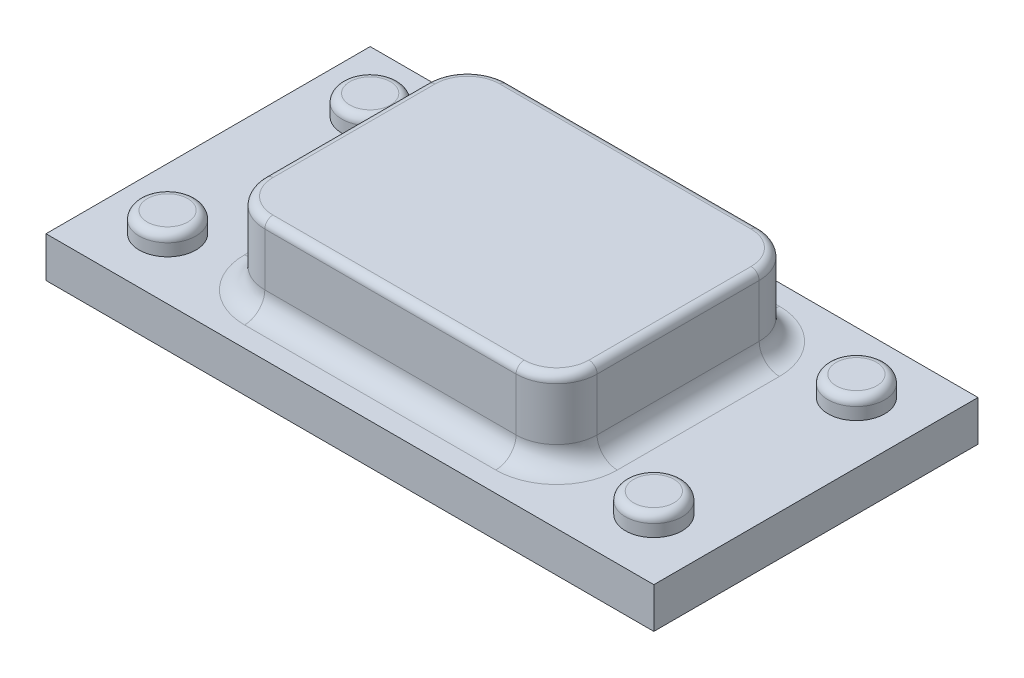
ISO-10303-21;
HEADER;
FILE_DESCRIPTION(('STEP AP214'),'2;1');
FILE_NAME('part.step','',(''),(''),'','','');
FILE_SCHEMA(('AUTOMOTIVE_DESIGN { 1 0 10303 214 1 1 1 1 }'));
ENDSEC;
DATA;
#1=APPLICATION_CONTEXT('core data for automotive mechanical design processes');
#2=APPLICATION_PROTOCOL_DEFINITION('international standard','automotive_design',2000,#1);
#3=PRODUCT_CONTEXT('',#1,'mechanical');
#4=PRODUCT('Part','Part','',(#3));
#5=PRODUCT_RELATED_PRODUCT_CATEGORY('part','',(#4));
#6=PRODUCT_DEFINITION_FORMATION('','',#4);
#7=PRODUCT_DEFINITION_CONTEXT('part definition',#1,'design');
#8=PRODUCT_DEFINITION('design','',#6,#7);
#9=PRODUCT_DEFINITION_SHAPE('','',#8);
#10=(LENGTH_UNIT() NAMED_UNIT(*) SI_UNIT(.MILLI.,.METRE.));
#11=(NAMED_UNIT(*) PLANE_ANGLE_UNIT() SI_UNIT($,.RADIAN.));
#12=(NAMED_UNIT(*) SI_UNIT($,.STERADIAN.) SOLID_ANGLE_UNIT());
#13=UNCERTAINTY_MEASURE_WITH_UNIT(LENGTH_MEASURE(1.E-05),#10,'distance_accuracy_value','');
#14=(GEOMETRIC_REPRESENTATION_CONTEXT(3) GLOBAL_UNCERTAINTY_ASSIGNED_CONTEXT((#13)) GLOBAL_UNIT_ASSIGNED_CONTEXT((#10,
#11,#12)) REPRESENTATION_CONTEXT('',''));
#15=CARTESIAN_POINT('',(0.,0.,0.));
#16=DIRECTION('',(0.,0.,1.));
#17=DIRECTION('',(1.,0.,0.));
#18=AXIS2_PLACEMENT_3D('',#15,#16,#17);
#19=CARTESIAN_POINT('',(0.,10.,0.));
#20=DIRECTION('',(0.,1.,0.));
#21=DIRECTION('',(0.,0.,1.));
#22=AXIS2_PLACEMENT_3D('',#19,#20,#21);
#23=PLANE('',#22);
#24=DIRECTION('',(-1.,0.,0.));
#25=VECTOR('',#24,1.);
#26=CARTESIAN_POINT('',(0.,10.,-35.));
#27=LINE('',#26,#25);
#28=CARTESIAN_POINT('',(-30.9999999999999,10.,-35.));
#29=VERTEX_POINT('',#28);
#30=CARTESIAN_POINT('',(30.9999999999999,10.,-35.));
#31=VERTEX_POINT('',#30);
#32=EDGE_CURVE('E293',#29,#31,#27,.F.);
#33=ORIENTED_EDGE('',*,*,#32,.T.);
#34=CARTESIAN_POINT('',(31.,10.,-20.));
#35=DIRECTION('',(0.,1.,0.));
#36=DIRECTION('',(0.,0.,1.));
#37=AXIS2_PLACEMENT_3D('',#34,#35,#36);
#38=CIRCLE('',#37,15.);
#39=CARTESIAN_POINT('',(46.,10.,-19.9999999999999));
#40=VERTEX_POINT('',#39);
#41=EDGE_CURVE('E307',#31,#40,#38,.F.);
#42=ORIENTED_EDGE('',*,*,#41,.T.);
#43=DIRECTION('',(0.,0.,-1.));
#44=VECTOR('',#43,1.);
#45=CARTESIAN_POINT('',(46.,10.,0.));
#46=LINE('',#45,#44);
#47=CARTESIAN_POINT('',(46.,10.,19.9999999999999));
#48=VERTEX_POINT('',#47);
#49=EDGE_CURVE('E305',#40,#48,#46,.F.);
#50=ORIENTED_EDGE('',*,*,#49,.T.);
#51=CARTESIAN_POINT('',(31.,10.,20.));
#52=DIRECTION('',(0.,1.,0.));
#53=DIRECTION('',(0.,0.,1.));
#54=AXIS2_PLACEMENT_3D('',#51,#52,#53);
#55=CIRCLE('',#54,15.);
#56=CARTESIAN_POINT('',(30.9999999999999,10.,35.));
#57=VERTEX_POINT('',#56);
#58=EDGE_CURVE('E303',#48,#57,#55,.F.);
#59=ORIENTED_EDGE('',*,*,#58,.T.);
#60=DIRECTION('',(1.,0.,0.));
#61=VECTOR('',#60,1.);
#62=CARTESIAN_POINT('',(0.,10.,35.));
#63=LINE('',#62,#61);
#64=CARTESIAN_POINT('',(-30.9999999999999,10.,35.));
#65=VERTEX_POINT('',#64);
#66=EDGE_CURVE('E301',#57,#65,#63,.F.);
#67=ORIENTED_EDGE('',*,*,#66,.T.);
#68=CARTESIAN_POINT('',(-31.,10.,20.));
#69=DIRECTION('',(0.,1.,0.));
#70=DIRECTION('',(0.,0.,1.));
#71=AXIS2_PLACEMENT_3D('',#68,#69,#70);
#72=CIRCLE('',#71,15.);
#73=CARTESIAN_POINT('',(-46.,10.,19.9999999999999));
#74=VERTEX_POINT('',#73);
#75=EDGE_CURVE('E299',#65,#74,#72,.F.);
#76=ORIENTED_EDGE('',*,*,#75,.T.);
#77=DIRECTION('',(0.,0.,1.));
#78=VECTOR('',#77,1.);
#79=CARTESIAN_POINT('',(-46.,10.,0.));
#80=LINE('',#79,#78);
#81=CARTESIAN_POINT('',(-46.,10.,-19.9999999999999));
#82=VERTEX_POINT('',#81);
#83=EDGE_CURVE('E297',#74,#82,#80,.F.);
#84=ORIENTED_EDGE('',*,*,#83,.T.);
#85=CARTESIAN_POINT('',(-31.,10.,-20.));
#86=DIRECTION('',(0.,1.,0.));
#87=DIRECTION('',(0.,0.,1.));
#88=AXIS2_PLACEMENT_3D('',#85,#86,#87);
#89=CIRCLE('',#88,15.);
#90=EDGE_CURVE('E295',#82,#29,#89,.F.);
#91=ORIENTED_EDGE('',*,*,#90,.T.);
#92=EDGE_LOOP('',(#33,#42,#50,#59,#67,#76,#84,#91));
#93=FACE_BOUND('',#92,.T.);
#94=CARTESIAN_POINT('',(60.,10.,-25.0000000000001));
#95=DIRECTION('',(0.,1.,0.));
#96=DIRECTION('',(0.,0.,-1.));
#97=AXIS2_PLACEMENT_3D('',#94,#95,#96);
#98=CIRCLE('',#97,7.);
#99=CARTESIAN_POINT('',(60.,10.,-32.0000000000001));
#100=VERTEX_POINT('',#99);
#101=EDGE_CURVE('E392',#100,#100,#98,.T.);
#102=ORIENTED_EDGE('',*,*,#101,.F.);
#103=EDGE_LOOP('',(#102));
#104=FACE_BOUND('',#103,.T.);
#105=CARTESIAN_POINT('',(60.0000000000001,10.,24.9999999999999));
#106=DIRECTION('',(0.,1.,0.));
#107=DIRECTION('',(0.,0.,-1.));
#108=AXIS2_PLACEMENT_3D('',#105,#106,#107);
#109=CIRCLE('',#108,7.);
#110=CARTESIAN_POINT('',(60.0000000000001,10.,17.9999999999999));
#111=VERTEX_POINT('',#110);
#112=EDGE_CURVE('E395',#111,#111,#109,.T.);
#113=ORIENTED_EDGE('',*,*,#112,.F.);
#114=EDGE_LOOP('',(#113));
#115=FACE_BOUND('',#114,.T.);
#116=CARTESIAN_POINT('',(-60.,10.,25.));
#117=DIRECTION('',(0.,1.,0.));
#118=DIRECTION('',(0.,0.,1.));
#119=AXIS2_PLACEMENT_3D('',#116,#117,#118);
#120=CIRCLE('',#119,7.);
#121=CARTESIAN_POINT('',(-60.,10.,32.));
#122=VERTEX_POINT('',#121);
#123=EDGE_CURVE('E398',#122,#122,#120,.T.);
#124=ORIENTED_EDGE('',*,*,#123,.F.);
#125=EDGE_LOOP('',(#124));
#126=FACE_BOUND('',#125,.T.);
#127=CARTESIAN_POINT('',(-60.,10.,-25.));
#128=DIRECTION('',(0.,1.,0.));
#129=DIRECTION('',(0.,0.,1.));
#130=AXIS2_PLACEMENT_3D('',#127,#128,#129);
#131=CIRCLE('',#130,7.);
#132=CARTESIAN_POINT('',(-60.,10.,-18.));
#133=VERTEX_POINT('',#132);
#134=EDGE_CURVE('E401',#133,#133,#131,.T.);
#135=ORIENTED_EDGE('',*,*,#134,.F.);
#136=EDGE_LOOP('',(#135));
#137=FACE_BOUND('',#136,.T.);
#138=DIRECTION('',(0.,0.,-1.));
#139=VECTOR('',#138,1.);
#140=CARTESIAN_POINT('',(75.,10.,-40.));
#141=LINE('',#140,#139);
#142=CARTESIAN_POINT('',(75.,10.,40.));
#143=VERTEX_POINT('',#142);
#144=CARTESIAN_POINT('',(75.,10.,-40.));
#145=VERTEX_POINT('',#144);
#146=EDGE_CURVE('E191',#143,#145,#141,.T.);
#147=ORIENTED_EDGE('',*,*,#146,.T.);
#148=DIRECTION('',(-1.,0.,0.));
#149=VECTOR('',#148,1.);
#150=CARTESIAN_POINT('',(-75.,10.,-40.));
#151=LINE('',#150,#149);
#152=CARTESIAN_POINT('',(-75.,10.,-40.));
#153=VERTEX_POINT('',#152);
#154=EDGE_CURVE('E180',#145,#153,#151,.T.);
#155=ORIENTED_EDGE('',*,*,#154,.T.);
#156=DIRECTION('',(0.,0.,1.));
#157=VECTOR('',#156,1.);
#158=CARTESIAN_POINT('',(-75.,10.,-40.));
#159=LINE('',#158,#157);
#160=CARTESIAN_POINT('',(-75.,10.,40.));
#161=VERTEX_POINT('',#160);
#162=EDGE_CURVE('E190',#153,#161,#159,.T.);
#163=ORIENTED_EDGE('',*,*,#162,.T.);
#164=DIRECTION('',(1.,0.,0.));
#165=VECTOR('',#164,1.);
#166=CARTESIAN_POINT('',(-75.,10.,40.));
#167=LINE('',#166,#165);
#168=EDGE_CURVE('E195',#161,#143,#167,.T.);
#169=ORIENTED_EDGE('',*,*,#168,.T.);
#170=EDGE_LOOP('',(#147,#155,#163,#169));
#171=FACE_BOUND('',#170,.T.);
#172=ADVANCED_FACE('F41',(#93,#104,#115,#126,#137,#171),#23,.T.);
#173=CARTESIAN_POINT('',(75.,10.,-40.));
#174=DIRECTION('',(-1.,0.,0.));
#175=DIRECTION('',(0.,0.,1.));
#176=AXIS2_PLACEMENT_3D('',#173,#174,#175);
#177=PLANE('',#176);
#178=DIRECTION('',(0.,0.,-1.));
#179=VECTOR('',#178,1.);
#180=CARTESIAN_POINT('',(75.,0.,-40.));
#181=LINE('',#180,#179);
#182=CARTESIAN_POINT('',(75.,0.,40.));
#183=VERTEX_POINT('',#182);
#184=CARTESIAN_POINT('',(75.,0.,-40.));
#185=VERTEX_POINT('',#184);
#186=EDGE_CURVE('E203',#183,#185,#181,.T.);
#187=ORIENTED_EDGE('',*,*,#186,.T.);
#188=DIRECTION('',(0.,-1.,0.));
#189=VECTOR('',#188,1.);
#190=CARTESIAN_POINT('',(75.,10.,-40.));
#191=LINE('',#190,#189);
#192=EDGE_CURVE('E184',#145,#185,#191,.T.);
#193=ORIENTED_EDGE('',*,*,#192,.F.);
#194=ORIENTED_EDGE('',*,*,#146,.F.);
#195=DIRECTION('',(0.,-1.,0.));
#196=VECTOR('',#195,1.);
#197=CARTESIAN_POINT('',(75.,10.,40.));
#198=LINE('',#197,#196);
#199=EDGE_CURVE('E406',#143,#183,#198,.T.);
#200=ORIENTED_EDGE('',*,*,#199,.T.);
#201=EDGE_LOOP('',(#187,#193,#194,#200));
#202=FACE_BOUND('',#201,.T.);
#203=ADVANCED_FACE('F201',(#202),#177,.F.);
#204=CARTESIAN_POINT('',(-75.,10.,-40.));
#205=DIRECTION('',(0.,0.,1.));
#206=DIRECTION('',(1.,0.,0.));
#207=AXIS2_PLACEMENT_3D('',#204,#205,#206);
#208=PLANE('',#207);
#209=DIRECTION('',(-1.,0.,0.));
#210=VECTOR('',#209,1.);
#211=CARTESIAN_POINT('',(-75.,0.,-40.));
#212=LINE('',#211,#210);
#213=CARTESIAN_POINT('',(-75.,0.,-40.));
#214=VERTEX_POINT('',#213);
#215=EDGE_CURVE('E408',#185,#214,#212,.T.);
#216=ORIENTED_EDGE('',*,*,#215,.T.);
#217=DIRECTION('',(0.,-1.,0.));
#218=VECTOR('',#217,1.);
#219=CARTESIAN_POINT('',(-75.,10.,-40.));
#220=LINE('',#219,#218);
#221=EDGE_CURVE('E187',#153,#214,#220,.T.);
#222=ORIENTED_EDGE('',*,*,#221,.F.);
#223=ORIENTED_EDGE('',*,*,#154,.F.);
#224=ORIENTED_EDGE('',*,*,#192,.T.);
#225=EDGE_LOOP('',(#216,#222,#223,#224));
#226=FACE_BOUND('',#225,.T.);
#227=ADVANCED_FACE('F182',(#226),#208,.F.);
#228=CARTESIAN_POINT('',(-75.,10.,-40.));
#229=DIRECTION('',(1.,0.,0.));
#230=DIRECTION('',(0.,0.,-1.));
#231=AXIS2_PLACEMENT_3D('',#228,#229,#230);
#232=PLANE('',#231);
#233=DIRECTION('',(0.,0.,1.));
#234=VECTOR('',#233,1.);
#235=CARTESIAN_POINT('',(-75.,0.,-40.));
#236=LINE('',#235,#234);
#237=CARTESIAN_POINT('',(-75.,0.,40.));
#238=VERTEX_POINT('',#237);
#239=EDGE_CURVE('E410',#214,#238,#236,.T.);
#240=ORIENTED_EDGE('',*,*,#239,.T.);
#241=DIRECTION('',(0.,-1.,0.));
#242=VECTOR('',#241,1.);
#243=CARTESIAN_POINT('',(-75.,10.,40.));
#244=LINE('',#243,#242);
#245=EDGE_CURVE('E209',#161,#238,#244,.T.);
#246=ORIENTED_EDGE('',*,*,#245,.F.);
#247=ORIENTED_EDGE('',*,*,#162,.F.);
#248=ORIENTED_EDGE('',*,*,#221,.T.);
#249=EDGE_LOOP('',(#240,#246,#247,#248));
#250=FACE_BOUND('',#249,.T.);
#251=ADVANCED_FACE('F422',(#250),#232,.F.);
#252=CARTESIAN_POINT('',(-75.,10.,40.));
#253=DIRECTION('',(0.,0.,-1.));
#254=DIRECTION('',(-1.,0.,0.));
#255=AXIS2_PLACEMENT_3D('',#252,#253,#254);
#256=PLANE('',#255);
#257=DIRECTION('',(1.,0.,0.));
#258=VECTOR('',#257,1.);
#259=CARTESIAN_POINT('',(-75.,0.,40.));
#260=LINE('',#259,#258);
#261=EDGE_CURVE('E199',#238,#183,#260,.T.);
#262=ORIENTED_EDGE('',*,*,#261,.T.);
#263=ORIENTED_EDGE('',*,*,#199,.F.);
#264=ORIENTED_EDGE('',*,*,#168,.F.);
#265=ORIENTED_EDGE('',*,*,#245,.T.);
#266=EDGE_LOOP('',(#262,#263,#264,#265));
#267=FACE_BOUND('',#266,.T.);
#268=ADVANCED_FACE('F417',(#267),#256,.F.);
#269=CARTESIAN_POINT('',(0.,0.,0.));
#270=DIRECTION('',(0.,1.,0.));
#271=DIRECTION('',(0.,0.,1.));
#272=AXIS2_PLACEMENT_3D('',#269,#270,#271);
#273=PLANE('',#272);
#274=ORIENTED_EDGE('',*,*,#186,.F.);
#275=ORIENTED_EDGE('',*,*,#261,.F.);
#276=ORIENTED_EDGE('',*,*,#239,.F.);
#277=ORIENTED_EDGE('',*,*,#215,.F.);
#278=EDGE_LOOP('',(#274,#275,#276,#277));
#279=FACE_BOUND('',#278,.T.);
#280=ADVANCED_FACE('F421',(#279),#273,.F.);
#281=CARTESIAN_POINT('',(-60.,15.,-25.));
#282=DIRECTION('',(0.,-1.,0.));
#283=DIRECTION('',(0.,0.,-1.));
#284=AXIS2_PLACEMENT_3D('',#281,#282,#283);
#285=CYLINDRICAL_SURFACE('',#284,7.);
#286=CARTESIAN_POINT('',(-60.,13.,-25.));
#287=DIRECTION('',(0.,1.,0.));
#288=DIRECTION('',(0.,0.,1.));
#289=AXIS2_PLACEMENT_3D('',#286,#287,#288);
#290=CIRCLE('',#289,7.);
#291=CARTESIAN_POINT('',(-60.,13.,-18.));
#292=VERTEX_POINT('',#291);
#293=EDGE_CURVE('E230',#292,#292,#290,.F.);
#294=ORIENTED_EDGE('',*,*,#293,.T.);
#295=EDGE_LOOP('',(#294));
#296=FACE_BOUND('',#295,.T.);
#297=ORIENTED_EDGE('',*,*,#134,.T.);
#298=EDGE_LOOP('',(#297));
#299=FACE_BOUND('',#298,.T.);
#300=ADVANCED_FACE('F440',(#296,#299),#285,.T.);
#301=CARTESIAN_POINT('',(-60.,15.,-25.));
#302=DIRECTION('',(0.,1.,0.));
#303=DIRECTION('',(0.,0.,1.));
#304=AXIS2_PLACEMENT_3D('',#301,#302,#303);
#305=PLANE('',#304);
#306=CARTESIAN_POINT('',(-60.,15.,-25.));
#307=DIRECTION('',(0.,1.,0.));
#308=DIRECTION('',(0.,0.,1.));
#309=AXIS2_PLACEMENT_3D('',#306,#307,#308);
#310=CIRCLE('',#309,5.);
#311=CARTESIAN_POINT('',(-60.,15.,-20.));
#312=VERTEX_POINT('',#311);
#313=EDGE_CURVE('E227',#312,#312,#310,.T.);
#314=ORIENTED_EDGE('',*,*,#313,.T.);
#315=EDGE_LOOP('',(#314));
#316=FACE_BOUND('',#315,.T.);
#317=ADVANCED_FACE('F446',(#316),#305,.T.);
#318=CARTESIAN_POINT('',(-60.,15.,25.));
#319=DIRECTION('',(0.,-1.,0.));
#320=DIRECTION('',(0.,0.,-1.));
#321=AXIS2_PLACEMENT_3D('',#318,#319,#320);
#322=CYLINDRICAL_SURFACE('',#321,7.);
#323=CARTESIAN_POINT('',(-60.,13.,25.));
#324=DIRECTION('',(0.,1.,0.));
#325=DIRECTION('',(0.,0.,1.));
#326=AXIS2_PLACEMENT_3D('',#323,#324,#325);
#327=CIRCLE('',#326,7.);
#328=CARTESIAN_POINT('',(-60.,13.,32.));
#329=VERTEX_POINT('',#328);
#330=EDGE_CURVE('E207',#329,#329,#327,.F.);
#331=ORIENTED_EDGE('',*,*,#330,.T.);
#332=EDGE_LOOP('',(#331));
#333=FACE_BOUND('',#332,.T.);
#334=ORIENTED_EDGE('',*,*,#123,.T.);
#335=EDGE_LOOP('',(#334));
#336=FACE_BOUND('',#335,.T.);
#337=ADVANCED_FACE('F451',(#333,#336),#322,.T.);
#338=CARTESIAN_POINT('',(-60.,15.,25.));
#339=DIRECTION('',(0.,1.,0.));
#340=DIRECTION('',(0.,0.,1.));
#341=AXIS2_PLACEMENT_3D('',#338,#339,#340);
#342=PLANE('',#341);
#343=CARTESIAN_POINT('',(-60.,15.,25.));
#344=DIRECTION('',(0.,1.,0.));
#345=DIRECTION('',(0.,0.,1.));
#346=AXIS2_PLACEMENT_3D('',#343,#344,#345);
#347=CIRCLE('',#346,5.);
#348=CARTESIAN_POINT('',(-60.,15.,30.));
#349=VERTEX_POINT('',#348);
#350=EDGE_CURVE('E204',#349,#349,#347,.T.);
#351=ORIENTED_EDGE('',*,*,#350,.T.);
#352=EDGE_LOOP('',(#351));
#353=FACE_BOUND('',#352,.T.);
#354=ADVANCED_FACE('F725',(#353),#342,.T.);
#355=CARTESIAN_POINT('',(60.0000000000001,15.,24.9999999999999));
#356=DIRECTION('',(0.,-1.,0.));
#357=DIRECTION('',(0.,0.,-1.));
#358=AXIS2_PLACEMENT_3D('',#355,#356,#357);
#359=CYLINDRICAL_SURFACE('',#358,7.);
#360=CARTESIAN_POINT('',(60.0000000000001,13.,24.9999999999999));
#361=DIRECTION('',(0.,-1.,0.));
#362=DIRECTION('',(0.,0.,-1.));
#363=AXIS2_PLACEMENT_3D('',#360,#361,#362);
#364=CIRCLE('',#363,7.);
#365=CARTESIAN_POINT('',(60.0000000000001,13.,17.9999999999999));
#366=VERTEX_POINT('',#365);
#367=EDGE_CURVE('E218',#366,#366,#364,.T.);
#368=ORIENTED_EDGE('',*,*,#367,.T.);
#369=EDGE_LOOP('',(#368));
#370=FACE_BOUND('',#369,.T.);
#371=ORIENTED_EDGE('',*,*,#112,.T.);
#372=EDGE_LOOP('',(#371));
#373=FACE_BOUND('',#372,.T.);
#374=ADVANCED_FACE('F715',(#370,#373),#359,.T.);
#375=CARTESIAN_POINT('',(60.0000000000001,15.,24.9999999999999));
#376=DIRECTION('',(0.,-1.,0.));
#377=DIRECTION('',(0.,0.,-1.));
#378=AXIS2_PLACEMENT_3D('',#375,#376,#377);
#379=PLANE('',#378);
#380=CARTESIAN_POINT('',(60.0000000000001,15.,24.9999999999999));
#381=DIRECTION('',(0.,-1.,0.));
#382=DIRECTION('',(0.,0.,-1.));
#383=AXIS2_PLACEMENT_3D('',#380,#381,#382);
#384=CIRCLE('',#383,5.);
#385=CARTESIAN_POINT('',(60.0000000000001,15.,19.9999999999999));
#386=VERTEX_POINT('',#385);
#387=EDGE_CURVE('E215',#386,#386,#384,.F.);
#388=ORIENTED_EDGE('',*,*,#387,.T.);
#389=EDGE_LOOP('',(#388));
#390=FACE_BOUND('',#389,.T.);
#391=ADVANCED_FACE('F705',(#390),#379,.F.);
#392=CARTESIAN_POINT('',(60.,15.,-25.0000000000001));
#393=DIRECTION('',(0.,-1.,0.));
#394=DIRECTION('',(0.,0.,-1.));
#395=AXIS2_PLACEMENT_3D('',#392,#393,#394);
#396=CYLINDRICAL_SURFACE('',#395,7.);
#397=CARTESIAN_POINT('',(60.,13.,-25.0000000000001));
#398=DIRECTION('',(0.,-1.,0.));
#399=DIRECTION('',(0.,0.,-1.));
#400=AXIS2_PLACEMENT_3D('',#397,#398,#399);
#401=CIRCLE('',#400,7.);
#402=CARTESIAN_POINT('',(60.,13.,-32.0000000000001));
#403=VERTEX_POINT('',#402);
#404=EDGE_CURVE('E224',#403,#403,#401,.T.);
#405=ORIENTED_EDGE('',*,*,#404,.T.);
#406=EDGE_LOOP('',(#405));
#407=FACE_BOUND('',#406,.T.);
#408=ORIENTED_EDGE('',*,*,#101,.T.);
#409=EDGE_LOOP('',(#408));
#410=FACE_BOUND('',#409,.T.);
#411=ADVANCED_FACE('F695',(#407,#410),#396,.T.);
#412=CARTESIAN_POINT('',(60.,15.,-25.0000000000001));
#413=DIRECTION('',(0.,-1.,0.));
#414=DIRECTION('',(0.,0.,-1.));
#415=AXIS2_PLACEMENT_3D('',#412,#413,#414);
#416=PLANE('',#415);
#417=CARTESIAN_POINT('',(60.,15.,-25.0000000000001));
#418=DIRECTION('',(0.,-1.,0.));
#419=DIRECTION('',(0.,0.,-1.));
#420=AXIS2_PLACEMENT_3D('',#417,#418,#419);
#421=CIRCLE('',#420,5.);
#422=CARTESIAN_POINT('',(60.,15.,-30.0000000000001));
#423=VERTEX_POINT('',#422);
#424=EDGE_CURVE('E221',#423,#423,#421,.F.);
#425=ORIENTED_EDGE('',*,*,#424,.T.);
#426=EDGE_LOOP('',(#425));
#427=FACE_BOUND('',#426,.T.);
#428=ADVANCED_FACE('F685',(#427),#416,.F.);
#429=CARTESIAN_POINT('',(-60.,13.,25.));
#430=DIRECTION('',(0.,1.,0.));
#431=DIRECTION('',(0.,0.,1.));
#432=AXIS2_PLACEMENT_3D('',#429,#430,#431);
#433=TOROIDAL_SURFACE('',#432,5.,2.);
#434=ORIENTED_EDGE('',*,*,#330,.F.);
#435=EDGE_LOOP('',(#434));
#436=FACE_BOUND('',#435,.T.);
#437=ORIENTED_EDGE('',*,*,#350,.F.);
#438=EDGE_LOOP('',(#437));
#439=FACE_BOUND('',#438,.T.);
#440=ADVANCED_FACE('F676',(#436,#439),#433,.T.);
#441=CARTESIAN_POINT('',(60.0000000000001,13.,24.9999999999999));
#442=DIRECTION('',(0.,-1.,0.));
#443=DIRECTION('',(0.,0.,-1.));
#444=AXIS2_PLACEMENT_3D('',#441,#442,#443);
#445=TOROIDAL_SURFACE('',#444,5.,2.);
#446=ORIENTED_EDGE('',*,*,#367,.F.);
#447=EDGE_LOOP('',(#446));
#448=FACE_BOUND('',#447,.T.);
#449=ORIENTED_EDGE('',*,*,#387,.F.);
#450=EDGE_LOOP('',(#449));
#451=FACE_BOUND('',#450,.T.);
#452=ADVANCED_FACE('F472',(#448,#451),#445,.T.);
#453=CARTESIAN_POINT('',(60.,13.,-25.0000000000001));
#454=DIRECTION('',(0.,-1.,0.));
#455=DIRECTION('',(0.,0.,-1.));
#456=AXIS2_PLACEMENT_3D('',#453,#454,#455);
#457=TOROIDAL_SURFACE('',#456,5.,2.);
#458=ORIENTED_EDGE('',*,*,#404,.F.);
#459=EDGE_LOOP('',(#458));
#460=FACE_BOUND('',#459,.T.);
#461=ORIENTED_EDGE('',*,*,#424,.F.);
#462=EDGE_LOOP('',(#461));
#463=FACE_BOUND('',#462,.T.);
#464=ADVANCED_FACE('F462',(#460,#463),#457,.T.);
#465=CARTESIAN_POINT('',(-60.,13.,-25.));
#466=DIRECTION('',(0.,1.,0.));
#467=DIRECTION('',(0.,0.,1.));
#468=AXIS2_PLACEMENT_3D('',#465,#466,#467);
#469=TOROIDAL_SURFACE('',#468,5.,2.);
#470=ORIENTED_EDGE('',*,*,#293,.F.);
#471=EDGE_LOOP('',(#470));
#472=FACE_BOUND('',#471,.T.);
#473=ORIENTED_EDGE('',*,*,#313,.F.);
#474=EDGE_LOOP('',(#473));
#475=FACE_BOUND('',#474,.T.);
#476=ADVANCED_FACE('F458',(#472,#475),#469,.T.);
#477=CARTESIAN_POINT('',(-31.,30.,20.));
#478=DIRECTION('',(0.,-1.,0.));
#479=DIRECTION('',(0.,0.,-1.));
#480=AXIS2_PLACEMENT_3D('',#477,#478,#479);
#481=CYLINDRICAL_SURFACE('',#480,10.);
#482=DIRECTION('',(0.,-1.,0.));
#483=VECTOR('',#482,1.);
#484=CARTESIAN_POINT('',(-41.,30.,19.9999999999999));
#485=LINE('',#484,#483);
#486=CARTESIAN_POINT('',(-41.,28.,19.9999999999999));
#487=VERTEX_POINT('',#486);
#488=CARTESIAN_POINT('',(-41.,15.,19.9999999999999));
#489=VERTEX_POINT('',#488);
#490=EDGE_CURVE('E290',#487,#489,#485,.T.);
#491=ORIENTED_EDGE('',*,*,#490,.T.);
#492=CARTESIAN_POINT('',(-31.,15.,20.));
#493=DIRECTION('',(0.,1.,0.));
#494=DIRECTION('',(0.,0.,1.));
#495=AXIS2_PLACEMENT_3D('',#492,#493,#494);
#496=CIRCLE('',#495,10.);
#497=CARTESIAN_POINT('',(-30.9999999999999,15.,30.));
#498=VERTEX_POINT('',#497);
#499=EDGE_CURVE('E316',#489,#498,#496,.T.);
#500=ORIENTED_EDGE('',*,*,#499,.T.);
#501=DIRECTION('',(0.,-1.,0.));
#502=VECTOR('',#501,1.);
#503=CARTESIAN_POINT('',(-30.9999999999999,30.,30.));
#504=LINE('',#503,#502);
#505=CARTESIAN_POINT('',(-30.9999999999999,28.,30.));
#506=VERTEX_POINT('',#505);
#507=EDGE_CURVE('E389',#506,#498,#504,.T.);
#508=ORIENTED_EDGE('',*,*,#507,.F.);
#509=CARTESIAN_POINT('',(-31.,28.,20.));
#510=DIRECTION('',(0.,1.,0.));
#511=DIRECTION('',(0.,0.,1.));
#512=AXIS2_PLACEMENT_3D('',#509,#510,#511);
#513=CIRCLE('',#512,10.);
#514=EDGE_CURVE('E265',#506,#487,#513,.F.);
#515=ORIENTED_EDGE('',*,*,#514,.T.);
#516=EDGE_LOOP('',(#491,#500,#508,#515));
#517=FACE_BOUND('',#516,.T.);
#518=ADVANCED_FACE('F461',(#517),#481,.T.);
#519=CARTESIAN_POINT('',(-30.9999999999999,30.,30.));
#520=DIRECTION('',(0.,0.,-1.));
#521=DIRECTION('',(-1.,0.,0.));
#522=AXIS2_PLACEMENT_3D('',#519,#520,#521);
#523=PLANE('',#522);
#524=ORIENTED_EDGE('',*,*,#507,.T.);
#525=DIRECTION('',(1.,0.,0.));
#526=VECTOR('',#525,1.);
#527=CARTESIAN_POINT('',(-30.9999999999999,15.,30.));
#528=LINE('',#527,#526);
#529=CARTESIAN_POINT('',(30.9999999999999,15.,30.));
#530=VERTEX_POINT('',#529);
#531=EDGE_CURVE('E314',#498,#530,#528,.T.);
#532=ORIENTED_EDGE('',*,*,#531,.T.);
#533=DIRECTION('',(0.,-1.,0.));
#534=VECTOR('',#533,1.);
#535=CARTESIAN_POINT('',(30.9999999999999,30.,30.));
#536=LINE('',#535,#534);
#537=CARTESIAN_POINT('',(30.9999999999999,28.,30.));
#538=VERTEX_POINT('',#537);
#539=EDGE_CURVE('E381',#538,#530,#536,.T.);
#540=ORIENTED_EDGE('',*,*,#539,.F.);
#541=DIRECTION('',(1.,0.,0.));
#542=VECTOR('',#541,1.);
#543=CARTESIAN_POINT('',(-30.9999999999999,28.,30.));
#544=LINE('',#543,#542);
#545=EDGE_CURVE('E263',#538,#506,#544,.F.);
#546=ORIENTED_EDGE('',*,*,#545,.T.);
#547=EDGE_LOOP('',(#524,#532,#540,#546));
#548=FACE_BOUND('',#547,.T.);
#549=ADVANCED_FACE('F469',(#548),#523,.F.);
#550=CARTESIAN_POINT('',(31.,30.,20.));
#551=DIRECTION('',(0.,-1.,0.));
#552=DIRECTION('',(0.,0.,-1.));
#553=AXIS2_PLACEMENT_3D('',#550,#551,#552);
#554=CYLINDRICAL_SURFACE('',#553,10.);
#555=ORIENTED_EDGE('',*,*,#539,.T.);
#556=CARTESIAN_POINT('',(31.,15.,20.));
#557=DIRECTION('',(0.,1.,0.));
#558=DIRECTION('',(0.,0.,1.));
#559=AXIS2_PLACEMENT_3D('',#556,#557,#558);
#560=CIRCLE('',#559,10.);
#561=CARTESIAN_POINT('',(41.,15.,19.9999999999999));
#562=VERTEX_POINT('',#561);
#563=EDGE_CURVE('E312',#530,#562,#560,.T.);
#564=ORIENTED_EDGE('',*,*,#563,.T.);
#565=DIRECTION('',(0.,-1.,0.));
#566=VECTOR('',#565,1.);
#567=CARTESIAN_POINT('',(41.,30.,19.9999999999999));
#568=LINE('',#567,#566);
#569=CARTESIAN_POINT('',(41.,28.,19.9999999999999));
#570=VERTEX_POINT('',#569);
#571=EDGE_CURVE('E374',#570,#562,#568,.T.);
#572=ORIENTED_EDGE('',*,*,#571,.F.);
#573=CARTESIAN_POINT('',(31.,28.,20.));
#574=DIRECTION('',(0.,1.,0.));
#575=DIRECTION('',(0.,0.,1.));
#576=AXIS2_PLACEMENT_3D('',#573,#574,#575);
#577=CIRCLE('',#576,10.);
#578=EDGE_CURVE('E261',#570,#538,#577,.F.);
#579=ORIENTED_EDGE('',*,*,#578,.T.);
#580=EDGE_LOOP('',(#555,#564,#572,#579));
#581=FACE_BOUND('',#580,.T.);
#582=ADVANCED_FACE('F626',(#581),#554,.T.);
#583=CARTESIAN_POINT('',(41.,30.,-19.9999999999999));
#584=DIRECTION('',(-1.,0.,0.));
#585=DIRECTION('',(0.,0.,1.));
#586=AXIS2_PLACEMENT_3D('',#583,#584,#585);
#587=PLANE('',#586);
#588=ORIENTED_EDGE('',*,*,#571,.T.);
#589=DIRECTION('',(0.,0.,-1.));
#590=VECTOR('',#589,1.);
#591=CARTESIAN_POINT('',(41.,15.,-19.9999999999999));
#592=LINE('',#591,#590);
#593=CARTESIAN_POINT('',(41.,15.,-19.9999999999999));
#594=VERTEX_POINT('',#593);
#595=EDGE_CURVE('E310',#562,#594,#592,.T.);
#596=ORIENTED_EDGE('',*,*,#595,.T.);
#597=DIRECTION('',(0.,-1.,0.));
#598=VECTOR('',#597,1.);
#599=CARTESIAN_POINT('',(41.,30.,-19.9999999999999));
#600=LINE('',#599,#598);
#601=CARTESIAN_POINT('',(41.,28.,-19.9999999999999));
#602=VERTEX_POINT('',#601);
#603=EDGE_CURVE('E371',#602,#594,#600,.T.);
#604=ORIENTED_EDGE('',*,*,#603,.F.);
#605=DIRECTION('',(0.,0.,-1.));
#606=VECTOR('',#605,1.);
#607=CARTESIAN_POINT('',(41.,28.,19.9999999999999));
#608=LINE('',#607,#606);
#609=EDGE_CURVE('E259',#602,#570,#608,.F.);
#610=ORIENTED_EDGE('',*,*,#609,.T.);
#611=EDGE_LOOP('',(#588,#596,#604,#610));
#612=FACE_BOUND('',#611,.T.);
#613=ADVANCED_FACE('F370',(#612),#587,.F.);
#614=CARTESIAN_POINT('',(31.,30.,-20.));
#615=DIRECTION('',(0.,-1.,0.));
#616=DIRECTION('',(0.,0.,-1.));
#617=AXIS2_PLACEMENT_3D('',#614,#615,#616);
#618=CYLINDRICAL_SURFACE('',#617,10.);
#619=ORIENTED_EDGE('',*,*,#603,.T.);
#620=CARTESIAN_POINT('',(31.,15.,-20.));
#621=DIRECTION('',(0.,1.,0.));
#622=DIRECTION('',(0.,0.,1.));
#623=AXIS2_PLACEMENT_3D('',#620,#621,#622);
#624=CIRCLE('',#623,10.);
#625=CARTESIAN_POINT('',(30.9999999999999,15.,-30.));
#626=VERTEX_POINT('',#625);
#627=EDGE_CURVE('E267',#594,#626,#624,.T.);
#628=ORIENTED_EDGE('',*,*,#627,.T.);
#629=DIRECTION('',(0.,-1.,0.));
#630=VECTOR('',#629,1.);
#631=CARTESIAN_POINT('',(30.9999999999999,30.,-30.));
#632=LINE('',#631,#630);
#633=CARTESIAN_POINT('',(30.9999999999999,28.,-30.));
#634=VERTEX_POINT('',#633);
#635=EDGE_CURVE('E379',#634,#626,#632,.T.);
#636=ORIENTED_EDGE('',*,*,#635,.F.);
#637=CARTESIAN_POINT('',(31.,28.,-20.));
#638=DIRECTION('',(0.,1.,0.));
#639=DIRECTION('',(0.,0.,1.));
#640=AXIS2_PLACEMENT_3D('',#637,#638,#639);
#641=CIRCLE('',#640,10.);
#642=EDGE_CURVE('E257',#634,#602,#641,.F.);
#643=ORIENTED_EDGE('',*,*,#642,.T.);
#644=EDGE_LOOP('',(#619,#628,#636,#643));
#645=FACE_BOUND('',#644,.T.);
#646=ADVANCED_FACE('F376',(#645),#618,.T.);
#647=CARTESIAN_POINT('',(-30.9999999999999,30.,-30.));
#648=DIRECTION('',(0.,0.,1.));
#649=DIRECTION('',(1.,0.,0.));
#650=AXIS2_PLACEMENT_3D('',#647,#648,#649);
#651=PLANE('',#650);
#652=ORIENTED_EDGE('',*,*,#635,.T.);
#653=DIRECTION('',(-1.,0.,0.));
#654=VECTOR('',#653,1.);
#655=CARTESIAN_POINT('',(-30.9999999999999,15.,-30.));
#656=LINE('',#655,#654);
#657=CARTESIAN_POINT('',(-30.9999999999999,15.,-30.));
#658=VERTEX_POINT('',#657);
#659=EDGE_CURVE('E12',#626,#658,#656,.T.);
#660=ORIENTED_EDGE('',*,*,#659,.T.);
#661=DIRECTION('',(0.,-1.,0.));
#662=VECTOR('',#661,1.);
#663=CARTESIAN_POINT('',(-30.9999999999999,30.,-30.));
#664=LINE('',#663,#662);
#665=CARTESIAN_POINT('',(-30.9999999999999,28.,-30.));
#666=VERTEX_POINT('',#665);
#667=EDGE_CURVE('E383',#666,#658,#664,.T.);
#668=ORIENTED_EDGE('',*,*,#667,.F.);
#669=DIRECTION('',(-1.,0.,0.));
#670=VECTOR('',#669,1.);
#671=CARTESIAN_POINT('',(30.9999999999999,28.,-30.));
#672=LINE('',#671,#670);
#673=EDGE_CURVE('E255',#666,#634,#672,.F.);
#674=ORIENTED_EDGE('',*,*,#673,.T.);
#675=EDGE_LOOP('',(#652,#660,#668,#674));
#676=FACE_BOUND('',#675,.T.);
#677=ADVANCED_FACE('F598',(#676),#651,.F.);
#678=CARTESIAN_POINT('',(-31.,30.,-20.));
#679=DIRECTION('',(0.,-1.,0.));
#680=DIRECTION('',(0.,0.,-1.));
#681=AXIS2_PLACEMENT_3D('',#678,#679,#680);
#682=CYLINDRICAL_SURFACE('',#681,10.);
#683=ORIENTED_EDGE('',*,*,#667,.T.);
#684=CARTESIAN_POINT('',(-31.,15.,-20.));
#685=DIRECTION('',(0.,1.,0.));
#686=DIRECTION('',(0.,0.,1.));
#687=AXIS2_PLACEMENT_3D('',#684,#685,#686);
#688=CIRCLE('',#687,10.);
#689=CARTESIAN_POINT('',(-41.,15.,-19.9999999999999));
#690=VERTEX_POINT('',#689);
#691=EDGE_CURVE('E50',#658,#690,#688,.T.);
#692=ORIENTED_EDGE('',*,*,#691,.T.);
#693=DIRECTION('',(0.,-1.,0.));
#694=VECTOR('',#693,1.);
#695=CARTESIAN_POINT('',(-41.,30.,-19.9999999999999));
#696=LINE('',#695,#694);
#697=CARTESIAN_POINT('',(-41.,28.,-19.9999999999999));
#698=VERTEX_POINT('',#697);
#699=EDGE_CURVE('E947',#698,#690,#696,.T.);
#700=ORIENTED_EDGE('',*,*,#699,.F.);
#701=CARTESIAN_POINT('',(-31.,28.,-20.));
#702=DIRECTION('',(0.,1.,0.));
#703=DIRECTION('',(0.,0.,1.));
#704=AXIS2_PLACEMENT_3D('',#701,#702,#703);
#705=CIRCLE('',#704,10.);
#706=EDGE_CURVE('E253',#698,#666,#705,.F.);
#707=ORIENTED_EDGE('',*,*,#706,.T.);
#708=EDGE_LOOP('',(#683,#692,#700,#707));
#709=FACE_BOUND('',#708,.T.);
#710=ADVANCED_FACE('F587',(#709),#682,.T.);
#711=CARTESIAN_POINT('',(-41.,30.,-19.9999999999999));
#712=DIRECTION('',(1.,0.,0.));
#713=DIRECTION('',(0.,0.,-1.));
#714=AXIS2_PLACEMENT_3D('',#711,#712,#713);
#715=PLANE('',#714);
#716=ORIENTED_EDGE('',*,*,#699,.T.);
#717=DIRECTION('',(0.,0.,1.));
#718=VECTOR('',#717,1.);
#719=CARTESIAN_POINT('',(-41.,15.,-19.9999999999999));
#720=LINE('',#719,#718);
#721=EDGE_CURVE('E318',#690,#489,#720,.T.);
#722=ORIENTED_EDGE('',*,*,#721,.T.);
#723=ORIENTED_EDGE('',*,*,#490,.F.);
#724=DIRECTION('',(0.,0.,1.));
#725=VECTOR('',#724,1.);
#726=CARTESIAN_POINT('',(-41.,28.,-19.9999999999999));
#727=LINE('',#726,#725);
#728=EDGE_CURVE('E250',#487,#698,#727,.F.);
#729=ORIENTED_EDGE('',*,*,#728,.T.);
#730=EDGE_LOOP('',(#716,#722,#723,#729));
#731=FACE_BOUND('',#730,.T.);
#732=ADVANCED_FACE('F574',(#731),#715,.F.);
#733=CARTESIAN_POINT('',(-31.,30.,20.));
#734=DIRECTION('',(0.,1.,0.));
#735=DIRECTION('',(0.,0.,1.));
#736=AXIS2_PLACEMENT_3D('',#733,#734,#735);
#737=PLANE('',#736);
#738=CARTESIAN_POINT('',(-31.,30.,-20.));
#739=DIRECTION('',(0.,1.,0.));
#740=DIRECTION('',(0.,0.,1.));
#741=AXIS2_PLACEMENT_3D('',#738,#739,#740);
#742=CIRCLE('',#741,8.);
#743=CARTESIAN_POINT('',(-31.,30.,-28.));
#744=VERTEX_POINT('',#743);
#745=CARTESIAN_POINT('',(-39.,30.,-19.9999999999999));
#746=VERTEX_POINT('',#745);
#747=EDGE_CURVE('E245',#744,#746,#742,.T.);
#748=ORIENTED_EDGE('',*,*,#747,.T.);
#749=DIRECTION('',(0.,0.,1.));
#750=VECTOR('',#749,1.);
#751=CARTESIAN_POINT('',(-39.,30.,19.9999999999999));
#752=LINE('',#751,#750);
#753=CARTESIAN_POINT('',(-39.,30.,19.9999999999999));
#754=VERTEX_POINT('',#753);
#755=EDGE_CURVE('E247',#746,#754,#752,.T.);
#756=ORIENTED_EDGE('',*,*,#755,.T.);
#757=CARTESIAN_POINT('',(-31.,30.,20.));
#758=DIRECTION('',(0.,1.,0.));
#759=DIRECTION('',(0.,0.,1.));
#760=AXIS2_PLACEMENT_3D('',#757,#758,#759);
#761=CIRCLE('',#760,8.);
#762=CARTESIAN_POINT('',(-30.9999999999999,30.,28.));
#763=VERTEX_POINT('',#762);
#764=EDGE_CURVE('E233',#754,#763,#761,.T.);
#765=ORIENTED_EDGE('',*,*,#764,.T.);
#766=DIRECTION('',(1.,0.,0.));
#767=VECTOR('',#766,1.);
#768=CARTESIAN_POINT('',(30.9999999999999,30.,28.));
#769=LINE('',#768,#767);
#770=CARTESIAN_POINT('',(31.,30.,28.));
#771=VERTEX_POINT('',#770);
#772=EDGE_CURVE('E235',#763,#771,#769,.T.);
#773=ORIENTED_EDGE('',*,*,#772,.T.);
#774=CARTESIAN_POINT('',(31.,30.,20.));
#775=DIRECTION('',(0.,1.,0.));
#776=DIRECTION('',(0.,0.,1.));
#777=AXIS2_PLACEMENT_3D('',#774,#775,#776);
#778=CIRCLE('',#777,8.);
#779=CARTESIAN_POINT('',(39.,30.,19.9999999999999));
#780=VERTEX_POINT('',#779);
#781=EDGE_CURVE('E237',#771,#780,#778,.T.);
#782=ORIENTED_EDGE('',*,*,#781,.T.);
#783=DIRECTION('',(0.,0.,-1.));
#784=VECTOR('',#783,1.);
#785=CARTESIAN_POINT('',(39.,30.,-19.9999999999999));
#786=LINE('',#785,#784);
#787=CARTESIAN_POINT('',(39.,30.,-19.9999999999999));
#788=VERTEX_POINT('',#787);
#789=EDGE_CURVE('E239',#780,#788,#786,.T.);
#790=ORIENTED_EDGE('',*,*,#789,.T.);
#791=CARTESIAN_POINT('',(31.,30.,-20.));
#792=DIRECTION('',(0.,1.,0.));
#793=DIRECTION('',(0.,0.,1.));
#794=AXIS2_PLACEMENT_3D('',#791,#792,#793);
#795=CIRCLE('',#794,8.);
#796=CARTESIAN_POINT('',(30.9999999999999,30.,-28.));
#797=VERTEX_POINT('',#796);
#798=EDGE_CURVE('E241',#788,#797,#795,.T.);
#799=ORIENTED_EDGE('',*,*,#798,.T.);
#800=DIRECTION('',(-1.,0.,0.));
#801=VECTOR('',#800,1.);
#802=CARTESIAN_POINT('',(-30.9999999999999,30.,-28.));
#803=LINE('',#802,#801);
#804=EDGE_CURVE('E243',#797,#744,#803,.T.);
#805=ORIENTED_EDGE('',*,*,#804,.T.);
#806=EDGE_LOOP('',(#748,#756,#765,#773,#782,#790,#799,#805));
#807=FACE_BOUND('',#806,.T.);
#808=ADVANCED_FACE('F508',(#807),#737,.T.);
#809=CARTESIAN_POINT('',(39.,28.,20.));
#810=DIRECTION('',(0.,0.,1.));
#811=DIRECTION('',(1.,0.,0.));
#812=AXIS2_PLACEMENT_3D('',#809,#810,#811);
#813=CYLINDRICAL_SURFACE('',#812,2.);
#814=CARTESIAN_POINT('',(39.,28.,19.9999999999999));
#815=DIRECTION('',(0.,0.,1.));
#816=DIRECTION('',(1.,0.,0.));
#817=AXIS2_PLACEMENT_3D('',#814,#815,#816);
#818=CIRCLE('',#817,2.);
#819=EDGE_CURVE('E284',#570,#780,#818,.T.);
#820=ORIENTED_EDGE('',*,*,#819,.F.);
#821=ORIENTED_EDGE('',*,*,#609,.F.);
#822=CARTESIAN_POINT('',(39.,28.,-19.9999999999999));
#823=DIRECTION('',(0.,0.,-1.));
#824=DIRECTION('',(-1.,0.,0.));
#825=AXIS2_PLACEMENT_3D('',#822,#823,#824);
#826=CIRCLE('',#825,2.);
#827=EDGE_CURVE('E287',#788,#602,#826,.T.);
#828=ORIENTED_EDGE('',*,*,#827,.F.);
#829=ORIENTED_EDGE('',*,*,#789,.F.);
#830=EDGE_LOOP('',(#820,#821,#828,#829));
#831=FACE_BOUND('',#830,.T.);
#832=ADVANCED_FACE('F504',(#831),#813,.T.);
#833=CARTESIAN_POINT('',(31.,28.,-20.));
#834=DIRECTION('',(0.,1.,0.));
#835=DIRECTION('',(0.,0.,1.));
#836=AXIS2_PLACEMENT_3D('',#833,#834,#835);
#837=TOROIDAL_SURFACE('',#836,8.,2.);
#838=ORIENTED_EDGE('',*,*,#827,.T.);
#839=ORIENTED_EDGE('',*,*,#642,.F.);
#840=CARTESIAN_POINT('',(30.9999999999999,28.,-28.));
#841=DIRECTION('',(-1.,0.,0.));
#842=DIRECTION('',(0.,0.,1.));
#843=AXIS2_PLACEMENT_3D('',#840,#841,#842);
#844=CIRCLE('',#843,2.);
#845=EDGE_CURVE('E281',#797,#634,#844,.T.);
#846=ORIENTED_EDGE('',*,*,#845,.F.);
#847=ORIENTED_EDGE('',*,*,#798,.F.);
#848=EDGE_LOOP('',(#838,#839,#846,#847));
#849=FACE_BOUND('',#848,.T.);
#850=ADVANCED_FACE('F500',(#849),#837,.T.);
#851=CARTESIAN_POINT('',(31.,28.,20.));
#852=DIRECTION('',(0.,1.,0.));
#853=DIRECTION('',(0.,0.,1.));
#854=AXIS2_PLACEMENT_3D('',#851,#852,#853);
#855=TOROIDAL_SURFACE('',#854,8.,2.);
#856=ORIENTED_EDGE('',*,*,#819,.T.);
#857=ORIENTED_EDGE('',*,*,#781,.F.);
#858=CARTESIAN_POINT('',(31.,28.,28.));
#859=DIRECTION('',(-1.,0.,0.));
#860=DIRECTION('',(0.,0.,1.));
#861=AXIS2_PLACEMENT_3D('',#858,#859,#860);
#862=CIRCLE('',#861,2.);
#863=EDGE_CURVE('E278',#538,#771,#862,.T.);
#864=ORIENTED_EDGE('',*,*,#863,.F.);
#865=ORIENTED_EDGE('',*,*,#578,.F.);
#866=EDGE_LOOP('',(#856,#857,#864,#865));
#867=FACE_BOUND('',#866,.T.);
#868=ADVANCED_FACE('F496',(#867),#855,.T.);
#869=CARTESIAN_POINT('',(-31.,28.,-28.));
#870=DIRECTION('',(1.,0.,0.));
#871=DIRECTION('',(0.,0.,-1.));
#872=AXIS2_PLACEMENT_3D('',#869,#870,#871);
#873=CYLINDRICAL_SURFACE('',#872,2.);
#874=ORIENTED_EDGE('',*,*,#845,.T.);
#875=ORIENTED_EDGE('',*,*,#673,.F.);
#876=CARTESIAN_POINT('',(-31.,28.,-28.));
#877=DIRECTION('',(-1.,0.,0.));
#878=DIRECTION('',(0.,0.,1.));
#879=AXIS2_PLACEMENT_3D('',#876,#877,#878);
#880=CIRCLE('',#879,2.);
#881=EDGE_CURVE('E275',#744,#666,#880,.T.);
#882=ORIENTED_EDGE('',*,*,#881,.F.);
#883=ORIENTED_EDGE('',*,*,#804,.F.);
#884=EDGE_LOOP('',(#874,#875,#882,#883));
#885=FACE_BOUND('',#884,.T.);
#886=ADVANCED_FACE('F492',(#885),#873,.T.);
#887=CARTESIAN_POINT('',(-31.,28.,28.));
#888=DIRECTION('',(-1.,0.,0.));
#889=DIRECTION('',(0.,0.,1.));
#890=AXIS2_PLACEMENT_3D('',#887,#888,#889);
#891=CYLINDRICAL_SURFACE('',#890,2.);
#892=ORIENTED_EDGE('',*,*,#863,.T.);
#893=ORIENTED_EDGE('',*,*,#772,.F.);
#894=CARTESIAN_POINT('',(-30.9999999999999,28.,28.));
#895=DIRECTION('',(-1.,0.,0.));
#896=DIRECTION('',(0.,0.,1.));
#897=AXIS2_PLACEMENT_3D('',#894,#895,#896);
#898=CIRCLE('',#897,2.);
#899=EDGE_CURVE('E272',#506,#763,#898,.T.);
#900=ORIENTED_EDGE('',*,*,#899,.F.);
#901=ORIENTED_EDGE('',*,*,#545,.F.);
#902=EDGE_LOOP('',(#892,#893,#900,#901));
#903=FACE_BOUND('',#902,.T.);
#904=ADVANCED_FACE('F488',(#903),#891,.T.);
#905=CARTESIAN_POINT('',(-31.,28.,-20.));
#906=DIRECTION('',(0.,1.,0.));
#907=DIRECTION('',(0.,0.,1.));
#908=AXIS2_PLACEMENT_3D('',#905,#906,#907);
#909=TOROIDAL_SURFACE('',#908,8.,2.);
#910=ORIENTED_EDGE('',*,*,#881,.T.);
#911=ORIENTED_EDGE('',*,*,#706,.F.);
#912=CARTESIAN_POINT('',(-39.,28.,-19.9999999999999));
#913=DIRECTION('',(0.,0.,1.));
#914=DIRECTION('',(1.,0.,0.));
#915=AXIS2_PLACEMENT_3D('',#912,#913,#914);
#916=CIRCLE('',#915,2.);
#917=EDGE_CURVE('E270',#746,#698,#916,.T.);
#918=ORIENTED_EDGE('',*,*,#917,.F.);
#919=ORIENTED_EDGE('',*,*,#747,.F.);
#920=EDGE_LOOP('',(#910,#911,#918,#919));
#921=FACE_BOUND('',#920,.T.);
#922=ADVANCED_FACE('F484',(#921),#909,.T.);
#923=CARTESIAN_POINT('',(-31.,28.,20.));
#924=DIRECTION('',(0.,1.,0.));
#925=DIRECTION('',(0.,0.,1.));
#926=AXIS2_PLACEMENT_3D('',#923,#924,#925);
#927=TOROIDAL_SURFACE('',#926,8.,2.);
#928=ORIENTED_EDGE('',*,*,#899,.T.);
#929=ORIENTED_EDGE('',*,*,#764,.F.);
#930=CARTESIAN_POINT('',(-39.,28.,19.9999999999999));
#931=DIRECTION('',(0.,0.,-1.));
#932=DIRECTION('',(-1.,0.,0.));
#933=AXIS2_PLACEMENT_3D('',#930,#931,#932);
#934=CIRCLE('',#933,2.);
#935=EDGE_CURVE('E268',#487,#754,#934,.T.);
#936=ORIENTED_EDGE('',*,*,#935,.F.);
#937=ORIENTED_EDGE('',*,*,#514,.F.);
#938=EDGE_LOOP('',(#928,#929,#936,#937));
#939=FACE_BOUND('',#938,.T.);
#940=ADVANCED_FACE('F480',(#939),#927,.T.);
#941=CARTESIAN_POINT('',(-39.,28.,20.));
#942=DIRECTION('',(0.,0.,-1.));
#943=DIRECTION('',(-1.,0.,0.));
#944=AXIS2_PLACEMENT_3D('',#941,#942,#943);
#945=CYLINDRICAL_SURFACE('',#944,2.);
#946=ORIENTED_EDGE('',*,*,#917,.T.);
#947=ORIENTED_EDGE('',*,*,#728,.F.);
#948=ORIENTED_EDGE('',*,*,#935,.T.);
#949=ORIENTED_EDGE('',*,*,#755,.F.);
#950=EDGE_LOOP('',(#946,#947,#948,#949));
#951=FACE_BOUND('',#950,.T.);
#952=ADVANCED_FACE('F477',(#951),#945,.T.);
#953=CARTESIAN_POINT('',(-31.,15.,20.));
#954=DIRECTION('',(0.,1.,0.));
#955=DIRECTION('',(0.,0.,1.));
#956=AXIS2_PLACEMENT_3D('',#953,#954,#955);
#957=TOROIDAL_SURFACE('',#956,15.,5.);
#958=CARTESIAN_POINT('',(-46.,15.,19.9999999999999));
#959=DIRECTION('',(0.,0.,1.));
#960=DIRECTION('',(1.,0.,0.));
#961=AXIS2_PLACEMENT_3D('',#958,#959,#960);
#962=CIRCLE('',#961,5.);
#963=EDGE_CURVE('E336',#74,#489,#962,.T.);
#964=ORIENTED_EDGE('',*,*,#963,.F.);
#965=ORIENTED_EDGE('',*,*,#75,.F.);
#966=CARTESIAN_POINT('',(-30.9999999999999,15.,35.));
#967=DIRECTION('',(-1.,0.,0.));
#968=DIRECTION('',(0.,0.,1.));
#969=AXIS2_PLACEMENT_3D('',#966,#967,#968);
#970=CIRCLE('',#969,5.);
#971=EDGE_CURVE('E45',#498,#65,#970,.T.);
#972=ORIENTED_EDGE('',*,*,#971,.F.);
#973=ORIENTED_EDGE('',*,*,#499,.F.);
#974=EDGE_LOOP('',(#964,#965,#972,#973));
#975=FACE_BOUND('',#974,.T.);
#976=ADVANCED_FACE('F43',(#975),#957,.F.);
#977=CARTESIAN_POINT('',(-30.9999999999999,15.,35.));
#978=DIRECTION('',(1.,0.,0.));
#979=DIRECTION('',(0.,0.,-1.));
#980=AXIS2_PLACEMENT_3D('',#977,#978,#979);
#981=CYLINDRICAL_SURFACE('',#980,5.);
#982=ORIENTED_EDGE('',*,*,#971,.T.);
#983=ORIENTED_EDGE('',*,*,#66,.F.);
#984=CARTESIAN_POINT('',(30.9999999999999,15.,35.));
#985=DIRECTION('',(-1.,0.,0.));
#986=DIRECTION('',(0.,-1.,0.));
#987=AXIS2_PLACEMENT_3D('',#984,#985,#986);
#988=CIRCLE('',#987,5.);
#989=EDGE_CURVE('E334',#530,#57,#988,.T.);
#990=ORIENTED_EDGE('',*,*,#989,.F.);
#991=ORIENTED_EDGE('',*,*,#531,.F.);
#992=EDGE_LOOP('',(#982,#983,#990,#991));
#993=FACE_BOUND('',#992,.T.);
#994=ADVANCED_FACE('F347',(#993),#981,.F.);
#995=CARTESIAN_POINT('',(-46.,15.,-19.9999999999999));
#996=DIRECTION('',(0.,0.,1.));
#997=DIRECTION('',(1.,0.,0.));
#998=AXIS2_PLACEMENT_3D('',#995,#996,#997);
#999=CYLINDRICAL_SURFACE('',#998,5.);
#1000=ORIENTED_EDGE('',*,*,#963,.T.);
#1001=ORIENTED_EDGE('',*,*,#721,.F.);
#1002=CARTESIAN_POINT('',(-46.,15.,-19.9999999999999));
#1003=DIRECTION('',(0.,0.,1.));
#1004=DIRECTION('',(1.,0.,0.));
#1005=AXIS2_PLACEMENT_3D('',#1002,#1003,#1004);
#1006=CIRCLE('',#1005,5.);
#1007=EDGE_CURVE('E331',#82,#690,#1006,.T.);
#1008=ORIENTED_EDGE('',*,*,#1007,.F.);
#1009=ORIENTED_EDGE('',*,*,#83,.F.);
#1010=EDGE_LOOP('',(#1000,#1001,#1008,#1009));
#1011=FACE_BOUND('',#1010,.T.);
#1012=ADVANCED_FACE('F526',(#1011),#999,.F.);
#1013=CARTESIAN_POINT('',(31.,15.,20.));
#1014=DIRECTION('',(0.,1.,0.));
#1015=DIRECTION('',(0.,0.,1.));
#1016=AXIS2_PLACEMENT_3D('',#1013,#1014,#1015);
#1017=TOROIDAL_SURFACE('',#1016,15.,5.);
#1018=ORIENTED_EDGE('',*,*,#989,.T.);
#1019=ORIENTED_EDGE('',*,*,#58,.F.);
#1020=CARTESIAN_POINT('',(46.,15.,19.9999999999999));
#1021=DIRECTION('',(0.,0.,1.));
#1022=DIRECTION('',(1.,0.,0.));
#1023=AXIS2_PLACEMENT_3D('',#1020,#1021,#1022);
#1024=CIRCLE('',#1023,5.);
#1025=EDGE_CURVE('E328',#562,#48,#1024,.T.);
#1026=ORIENTED_EDGE('',*,*,#1025,.F.);
#1027=ORIENTED_EDGE('',*,*,#563,.F.);
#1028=EDGE_LOOP('',(#1018,#1019,#1026,#1027));
#1029=FACE_BOUND('',#1028,.T.);
#1030=ADVANCED_FACE('F359',(#1029),#1017,.F.);
#1031=CARTESIAN_POINT('',(-31.,15.,-20.));
#1032=DIRECTION('',(0.,1.,0.));
#1033=DIRECTION('',(0.,0.,1.));
#1034=AXIS2_PLACEMENT_3D('',#1031,#1032,#1033);
#1035=TOROIDAL_SURFACE('',#1034,15.,5.);
#1036=ORIENTED_EDGE('',*,*,#1007,.T.);
#1037=ORIENTED_EDGE('',*,*,#691,.F.);
#1038=CARTESIAN_POINT('',(-30.9999999999999,15.,-35.));
#1039=DIRECTION('',(-1.,0.,0.));
#1040=DIRECTION('',(0.,0.,1.));
#1041=AXIS2_PLACEMENT_3D('',#1038,#1039,#1040);
#1042=CIRCLE('',#1041,5.);
#1043=EDGE_CURVE('E325',#29,#658,#1042,.T.);
#1044=ORIENTED_EDGE('',*,*,#1043,.F.);
#1045=ORIENTED_EDGE('',*,*,#90,.F.);
#1046=EDGE_LOOP('',(#1036,#1037,#1044,#1045));
#1047=FACE_BOUND('',#1046,.T.);
#1048=ADVANCED_FACE('F520',(#1047),#1035,.F.);
#1049=CARTESIAN_POINT('',(46.,15.,-19.9999999999999));
#1050=DIRECTION('',(0.,0.,-1.));
#1051=DIRECTION('',(-1.,0.,0.));
#1052=AXIS2_PLACEMENT_3D('',#1049,#1050,#1051);
#1053=CYLINDRICAL_SURFACE('',#1052,5.);
#1054=ORIENTED_EDGE('',*,*,#1025,.T.);
#1055=ORIENTED_EDGE('',*,*,#49,.F.);
#1056=CARTESIAN_POINT('',(46.,15.,-19.9999999999999));
#1057=DIRECTION('',(0.,0.,1.));
#1058=DIRECTION('',(0.,-1.,0.));
#1059=AXIS2_PLACEMENT_3D('',#1056,#1057,#1058);
#1060=CIRCLE('',#1059,5.);
#1061=EDGE_CURVE('E323',#594,#40,#1060,.T.);
#1062=ORIENTED_EDGE('',*,*,#1061,.F.);
#1063=ORIENTED_EDGE('',*,*,#595,.F.);
#1064=EDGE_LOOP('',(#1054,#1055,#1062,#1063));
#1065=FACE_BOUND('',#1064,.T.);
#1066=ADVANCED_FACE('F363',(#1065),#1053,.F.);
#1067=CARTESIAN_POINT('',(-30.9999999999999,15.,-35.));
#1068=DIRECTION('',(-1.,0.,0.));
#1069=DIRECTION('',(0.,0.,1.));
#1070=AXIS2_PLACEMENT_3D('',#1067,#1068,#1069);
#1071=CYLINDRICAL_SURFACE('',#1070,5.);
#1072=ORIENTED_EDGE('',*,*,#1043,.T.);
#1073=ORIENTED_EDGE('',*,*,#659,.F.);
#1074=CARTESIAN_POINT('',(30.9999999999999,15.,-35.));
#1075=DIRECTION('',(-1.,0.,0.));
#1076=DIRECTION('',(0.,0.,1.));
#1077=AXIS2_PLACEMENT_3D('',#1074,#1075,#1076);
#1078=CIRCLE('',#1077,5.);
#1079=EDGE_CURVE('E321',#31,#626,#1078,.T.);
#1080=ORIENTED_EDGE('',*,*,#1079,.F.);
#1081=ORIENTED_EDGE('',*,*,#32,.F.);
#1082=EDGE_LOOP('',(#1072,#1073,#1080,#1081));
#1083=FACE_BOUND('',#1082,.T.);
#1084=ADVANCED_FACE('F513',(#1083),#1071,.F.);
#1085=CARTESIAN_POINT('',(31.,15.,-20.));
#1086=DIRECTION('',(0.,1.,0.));
#1087=DIRECTION('',(0.,0.,1.));
#1088=AXIS2_PLACEMENT_3D('',#1085,#1086,#1087);
#1089=TOROIDAL_SURFACE('',#1088,15.,5.);
#1090=ORIENTED_EDGE('',*,*,#1061,.T.);
#1091=ORIENTED_EDGE('',*,*,#41,.F.);
#1092=ORIENTED_EDGE('',*,*,#1079,.T.);
#1093=ORIENTED_EDGE('',*,*,#627,.F.);
#1094=EDGE_LOOP('',(#1090,#1091,#1092,#1093));
#1095=FACE_BOUND('',#1094,.T.);
#1096=ADVANCED_FACE('F510',(#1095),#1089,.F.);
#1097=CLOSED_SHELL('',(#172,#203,#227,#251,#268,#280,#300,#317,#337,#354,#374,#391,#411,#428,
#440,#452,#464,#476,#518,#549,#582,#613,#646,#677,#710,#732,#808,#832,#850,#868,#886,#904,#922,
#940,#952,#976,#994,#1012,#1030,#1048,#1066,#1084,#1096));
#1098=MANIFOLD_SOLID_BREP('B2',#1097);
#1099=ADVANCED_BREP_SHAPE_REPRESENTATION('',(#18,#1098),#14);
#1100=SHAPE_DEFINITION_REPRESENTATION(#9,#1099);
ENDSEC;
END-ISO-10303-21;
